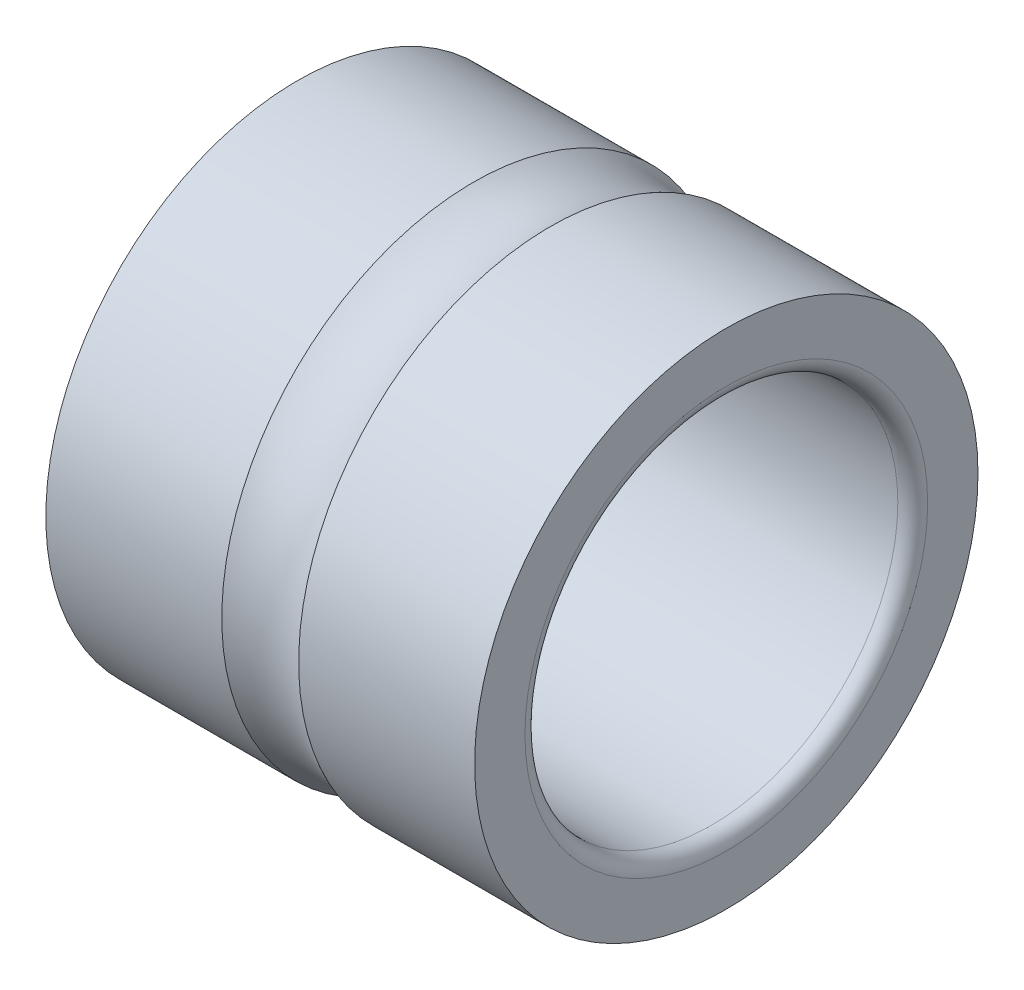
ISO-10303-21;
HEADER;
FILE_DESCRIPTION(('STEP AP214'),'2;1');
FILE_NAME('part.step','',(''),(''),'','','');
FILE_SCHEMA(('AUTOMOTIVE_DESIGN { 1 0 10303 214 1 1 1 1 }'));
ENDSEC;
DATA;
#1=APPLICATION_CONTEXT('core data for automotive mechanical design processes');
#2=APPLICATION_PROTOCOL_DEFINITION('international standard','automotive_design',2000,#1);
#3=PRODUCT_CONTEXT('',#1,'mechanical');
#4=PRODUCT('Part','Part','',(#3));
#5=PRODUCT_RELATED_PRODUCT_CATEGORY('part','',(#4));
#6=PRODUCT_DEFINITION_FORMATION('','',#4);
#7=PRODUCT_DEFINITION_CONTEXT('part definition',#1,'design');
#8=PRODUCT_DEFINITION('design','',#6,#7);
#9=PRODUCT_DEFINITION_SHAPE('','',#8);
#10=(LENGTH_UNIT() NAMED_UNIT(*) SI_UNIT(.MILLI.,.METRE.));
#11=(NAMED_UNIT(*) PLANE_ANGLE_UNIT() SI_UNIT($,.RADIAN.));
#12=(NAMED_UNIT(*) SI_UNIT($,.STERADIAN.) SOLID_ANGLE_UNIT());
#13=UNCERTAINTY_MEASURE_WITH_UNIT(LENGTH_MEASURE(1.E-05),#10,'distance_accuracy_value','');
#14=(GEOMETRIC_REPRESENTATION_CONTEXT(3) GLOBAL_UNCERTAINTY_ASSIGNED_CONTEXT((#13)) GLOBAL_UNIT_ASSIGNED_CONTEXT((#10,
#11,#12)) REPRESENTATION_CONTEXT('',''));
#15=CARTESIAN_POINT('',(0.,0.,0.));
#16=DIRECTION('',(0.,0.,1.));
#17=DIRECTION('',(1.,0.,0.));
#18=AXIS2_PLACEMENT_3D('',#15,#16,#17);
#19=CARTESIAN_POINT('',(0.,1.35,0.));
#20=DIRECTION('',(-1.,0.,0.));
#21=DIRECTION('',(0.,0.,1.));
#22=AXIS2_PLACEMENT_3D('',#19,#20,#21);
#23=PLANE('',#22);
#24=CARTESIAN_POINT('',(0.,0.,0.));
#25=DIRECTION('',(1.,0.,0.));
#26=DIRECTION('',(0.,0.,-1.));
#27=AXIS2_PLACEMENT_3D('',#24,#25,#26);
#28=CIRCLE('',#27,1.08000000000004);
#29=CARTESIAN_POINT('',(0.,0.,-1.08000000000004));
#30=VERTEX_POINT('',#29);
#31=EDGE_CURVE('E44',#30,#30,#28,.T.);
#32=ORIENTED_EDGE('',*,*,#31,.T.);
#33=EDGE_LOOP('',(#32));
#34=FACE_BOUND('',#33,.T.);
#35=CARTESIAN_POINT('',(0.,0.,0.));
#36=DIRECTION('',(1.,0.,0.));
#37=DIRECTION('',(0.,0.,-1.));
#38=AXIS2_PLACEMENT_3D('',#35,#36,#37);
#39=CIRCLE('',#38,1.35);
#40=CARTESIAN_POINT('',(0.,0.,-1.35));
#41=VERTEX_POINT('',#40);
#42=EDGE_CURVE('E41',#41,#41,#39,.T.);
#43=ORIENTED_EDGE('',*,*,#42,.F.);
#44=EDGE_LOOP('',(#43));
#45=FACE_BOUND('',#44,.T.);
#46=ADVANCED_FACE('F15',(#34,#45),#23,.T.);
#47=CARTESIAN_POINT('',(0.0800000000000402,0.,0.));
#48=DIRECTION('',(1.,0.,0.));
#49=DIRECTION('',(0.,0.,-1.));
#50=AXIS2_PLACEMENT_3D('',#47,#48,#49);
#51=TOROIDAL_SURFACE('',#50,1.08000000000004,0.0800000000000402);
#52=CARTESIAN_POINT('',(0.08,0.,0.));
#53=DIRECTION('',(1.,0.,0.));
#54=DIRECTION('',(0.,0.,-1.));
#55=AXIS2_PLACEMENT_3D('',#52,#53,#54);
#56=CIRCLE('',#55,1.);
#57=CARTESIAN_POINT('',(0.08,0.,-1.));
#58=VERTEX_POINT('',#57);
#59=EDGE_CURVE('E38',#58,#58,#56,.T.);
#60=ORIENTED_EDGE('',*,*,#59,.T.);
#61=EDGE_LOOP('',(#60));
#62=FACE_BOUND('',#61,.T.);
#63=ORIENTED_EDGE('',*,*,#31,.F.);
#64=EDGE_LOOP('',(#63));
#65=FACE_BOUND('',#64,.T.);
#66=ADVANCED_FACE('F50',(#62,#65),#51,.T.);
#67=CARTESIAN_POINT('',(2.3,0.,0.));
#68=DIRECTION('',(1.,0.,0.));
#69=DIRECTION('',(0.,0.,-1.));
#70=AXIS2_PLACEMENT_3D('',#67,#68,#69);
#71=CYLINDRICAL_SURFACE('',#70,1.);
#72=CARTESIAN_POINT('',(2.22,0.,0.));
#73=DIRECTION('',(1.,0.,0.));
#74=DIRECTION('',(0.,0.,-1.));
#75=AXIS2_PLACEMENT_3D('',#72,#73,#74);
#76=CIRCLE('',#75,1.);
#77=CARTESIAN_POINT('',(2.22,0.,-1.));
#78=VERTEX_POINT('',#77);
#79=EDGE_CURVE('E35',#78,#78,#76,.T.);
#80=ORIENTED_EDGE('',*,*,#79,.T.);
#81=EDGE_LOOP('',(#80));
#82=FACE_BOUND('',#81,.T.);
#83=ORIENTED_EDGE('',*,*,#59,.F.);
#84=EDGE_LOOP('',(#83));
#85=FACE_BOUND('',#84,.T.);
#86=ADVANCED_FACE('F52',(#82,#85),#71,.F.);
#87=CARTESIAN_POINT('',(2.21999999999992,0.,0.));
#88=DIRECTION('',(1.,0.,0.));
#89=DIRECTION('',(0.,0.,-1.));
#90=AXIS2_PLACEMENT_3D('',#87,#88,#89);
#91=TOROIDAL_SURFACE('',#90,1.08000000000008,0.0800000000000815);
#92=CARTESIAN_POINT('',(2.3,0.,0.));
#93=DIRECTION('',(1.,0.,0.));
#94=DIRECTION('',(0.,0.,-1.));
#95=AXIS2_PLACEMENT_3D('',#92,#93,#94);
#96=CIRCLE('',#95,1.07999998459485);
#97=CARTESIAN_POINT('',(2.3,0.,-1.07999998459485));
#98=VERTEX_POINT('',#97);
#99=EDGE_CURVE('E30',#98,#98,#96,.T.);
#100=ORIENTED_EDGE('',*,*,#99,.T.);
#101=EDGE_LOOP('',(#100));
#102=FACE_BOUND('',#101,.T.);
#103=ORIENTED_EDGE('',*,*,#79,.F.);
#104=EDGE_LOOP('',(#103));
#105=FACE_BOUND('',#104,.T.);
#106=ADVANCED_FACE('F60',(#102,#105),#91,.T.);
#107=CARTESIAN_POINT('',(2.3,1.08,0.));
#108=DIRECTION('',(1.,0.,0.));
#109=DIRECTION('',(0.,0.,-1.));
#110=AXIS2_PLACEMENT_3D('',#107,#108,#109);
#111=PLANE('',#110);
#112=CARTESIAN_POINT('',(2.3,0.,0.));
#113=DIRECTION('',(1.,0.,0.));
#114=DIRECTION('',(0.,0.,-1.));
#115=AXIS2_PLACEMENT_3D('',#112,#113,#114);
#116=CIRCLE('',#115,1.35);
#117=CARTESIAN_POINT('',(2.3,0.,-1.35));
#118=VERTEX_POINT('',#117);
#119=EDGE_CURVE('E26',#118,#118,#116,.T.);
#120=ORIENTED_EDGE('',*,*,#119,.T.);
#121=EDGE_LOOP('',(#120));
#122=FACE_BOUND('',#121,.T.);
#123=ORIENTED_EDGE('',*,*,#99,.F.);
#124=EDGE_LOOP('',(#123));
#125=FACE_BOUND('',#124,.T.);
#126=ADVANCED_FACE('F67',(#122,#125),#111,.T.);
#127=CARTESIAN_POINT('',(2.3,0.,0.));
#128=DIRECTION('',(1.,0.,0.));
#129=DIRECTION('',(0.,0.,-1.));
#130=AXIS2_PLACEMENT_3D('',#127,#128,#129);
#131=CYLINDRICAL_SURFACE('',#130,1.35);
#132=CARTESIAN_POINT('',(1.3561552812809,0.,0.));
#133=DIRECTION('',(1.,0.,0.));
#134=DIRECTION('',(0.,0.,-1.));
#135=AXIS2_PLACEMENT_3D('',#132,#133,#134);
#136=CIRCLE('',#135,1.35);
#137=CARTESIAN_POINT('',(1.3561552812809,0.,-1.35));
#138=VERTEX_POINT('',#137);
#139=EDGE_CURVE('E22',#138,#138,#136,.T.);
#140=ORIENTED_EDGE('',*,*,#139,.T.);
#141=EDGE_LOOP('',(#140));
#142=FACE_BOUND('',#141,.T.);
#143=ORIENTED_EDGE('',*,*,#119,.F.);
#144=EDGE_LOOP('',(#143));
#145=FACE_BOUND('',#144,.T.);
#146=ADVANCED_FACE('F71',(#142,#145),#131,.T.);
#147=CARTESIAN_POINT('',(1.15,0.,0.));
#148=DIRECTION('',(1.,0.,0.));
#149=DIRECTION('',(0.,0.,-1.));
#150=AXIS2_PLACEMENT_3D('',#147,#148,#149);
#151=TOROIDAL_SURFACE('',#150,1.75000000000003,0.45000000000003);
#152=ORIENTED_EDGE('',*,*,#139,.F.);
#153=EDGE_LOOP('',(#152));
#154=FACE_BOUND('',#153,.T.);
#155=CARTESIAN_POINT('',(0.94384471871912,0.,0.));
#156=DIRECTION('',(1.,0.,0.));
#157=DIRECTION('',(0.,0.,-1.));
#158=AXIS2_PLACEMENT_3D('',#155,#156,#157);
#159=CIRCLE('',#158,1.35);
#160=CARTESIAN_POINT('',(0.94384471871912,0.,-1.35));
#161=VERTEX_POINT('',#160);
#162=EDGE_CURVE('E10',#161,#161,#159,.T.);
#163=ORIENTED_EDGE('',*,*,#162,.T.);
#164=EDGE_LOOP('',(#163));
#165=FACE_BOUND('',#164,.T.);
#166=ADVANCED_FACE('F74',(#154,#165),#151,.F.);
#167=CARTESIAN_POINT('',(2.3,0.,0.));
#168=DIRECTION('',(1.,0.,0.));
#169=DIRECTION('',(0.,0.,-1.));
#170=AXIS2_PLACEMENT_3D('',#167,#168,#169);
#171=CYLINDRICAL_SURFACE('',#170,1.35);
#172=ORIENTED_EDGE('',*,*,#42,.T.);
#173=EDGE_LOOP('',(#172));
#174=FACE_BOUND('',#173,.T.);
#175=ORIENTED_EDGE('',*,*,#162,.F.);
#176=EDGE_LOOP('',(#175));
#177=FACE_BOUND('',#176,.T.);
#178=ADVANCED_FACE('F17',(#174,#177),#171,.T.);
#179=CLOSED_SHELL('',(#46,#66,#86,#106,#126,#146,#166,#178));
#180=MANIFOLD_SOLID_BREP('B1',#179);
#181=ADVANCED_BREP_SHAPE_REPRESENTATION('',(#18,#180),#14);
#182=SHAPE_DEFINITION_REPRESENTATION(#9,#181);
ENDSEC;
END-ISO-10303-21;
